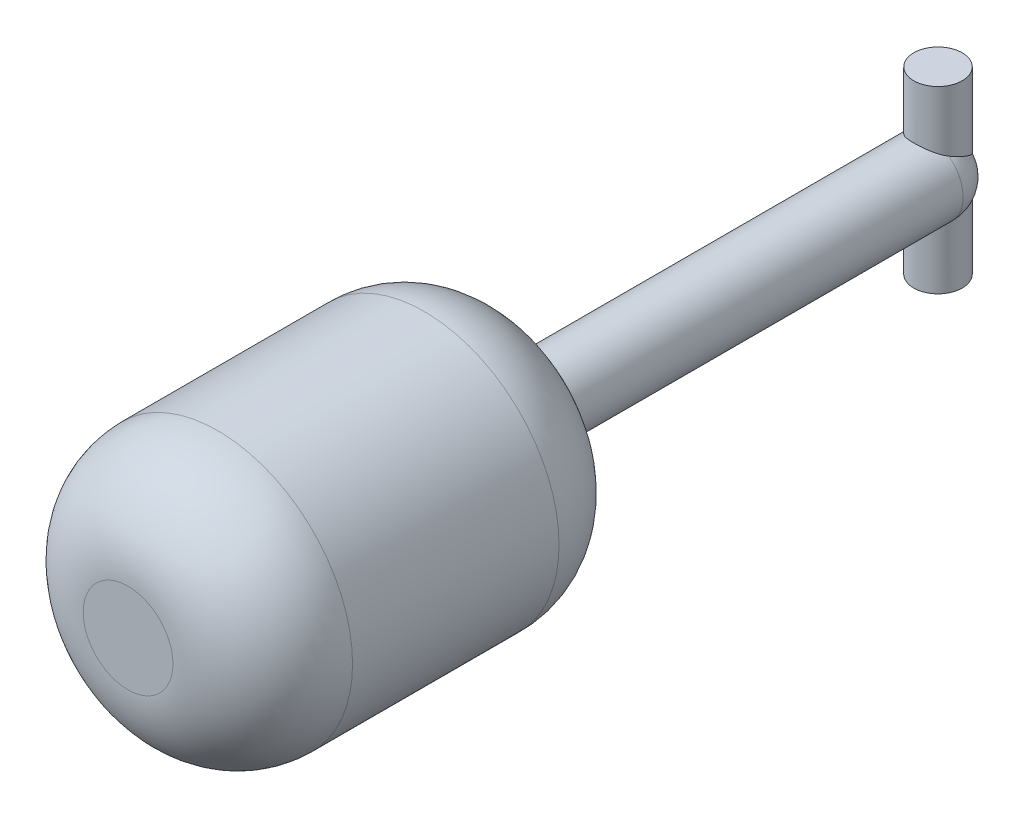
ISO-10303-21;
HEADER;
FILE_DESCRIPTION(('STEP AP214'),'2;1');
FILE_NAME('part.step','',(''),(''),'','','');
FILE_SCHEMA(('AUTOMOTIVE_DESIGN { 1 0 10303 214 1 1 1 1 }'));
ENDSEC;
DATA;
#1=APPLICATION_CONTEXT('core data for automotive mechanical design processes');
#2=APPLICATION_PROTOCOL_DEFINITION('international standard','automotive_design',2000,#1);
#3=PRODUCT_CONTEXT('',#1,'mechanical');
#4=PRODUCT('Part','Part','',(#3));
#5=PRODUCT_RELATED_PRODUCT_CATEGORY('part','',(#4));
#6=PRODUCT_DEFINITION_FORMATION('','',#4);
#7=PRODUCT_DEFINITION_CONTEXT('part definition',#1,'design');
#8=PRODUCT_DEFINITION('design','',#6,#7);
#9=PRODUCT_DEFINITION_SHAPE('','',#8);
#10=(LENGTH_UNIT() NAMED_UNIT(*) SI_UNIT(.MILLI.,.METRE.));
#11=(NAMED_UNIT(*) PLANE_ANGLE_UNIT() SI_UNIT($,.RADIAN.));
#12=(NAMED_UNIT(*) SI_UNIT($,.STERADIAN.) SOLID_ANGLE_UNIT());
#13=UNCERTAINTY_MEASURE_WITH_UNIT(LENGTH_MEASURE(1.E-05),#10,'distance_accuracy_value','');
#14=(GEOMETRIC_REPRESENTATION_CONTEXT(3) GLOBAL_UNCERTAINTY_ASSIGNED_CONTEXT((#13)) GLOBAL_UNIT_ASSIGNED_CONTEXT((#10,
#11,#12)) REPRESENTATION_CONTEXT('',''));
#15=CARTESIAN_POINT('',(0.,0.,0.));
#16=DIRECTION('',(0.,0.,1.));
#17=DIRECTION('',(1.,0.,0.));
#18=AXIS2_PLACEMENT_3D('',#15,#16,#17);
#19=CARTESIAN_POINT('',(0.,0.,90.));
#20=DIRECTION('',(0.,0.,-1.));
#21=DIRECTION('',(-1.,0.,0.));
#22=AXIS2_PLACEMENT_3D('',#19,#20,#21);
#23=CYLINDRICAL_SURFACE('',#22,15.);
#24=CARTESIAN_POINT('',(0.,0.,83.));
#25=DIRECTION('',(0.,0.,1.));
#26=DIRECTION('',(1.,0.,0.));
#27=AXIS2_PLACEMENT_3D('',#24,#25,#26);
#28=CIRCLE('',#27,15.);
#29=CARTESIAN_POINT('',(15.,0.,83.));
#30=VERTEX_POINT('',#29);
#31=EDGE_CURVE('E11',#30,#30,#28,.F.);
#32=ORIENTED_EDGE('',*,*,#31,.T.);
#33=EDGE_LOOP('',(#32));
#34=FACE_BOUND('',#33,.T.);
#35=CARTESIAN_POINT('',(0.,0.,60.));
#36=DIRECTION('',(0.,0.,1.));
#37=DIRECTION('',(1.,0.,0.));
#38=AXIS2_PLACEMENT_3D('',#35,#36,#37);
#39=CIRCLE('',#38,15.);
#40=CARTESIAN_POINT('',(15.,0.,60.));
#41=VERTEX_POINT('',#40);
#42=EDGE_CURVE('E60',#41,#41,#39,.T.);
#43=ORIENTED_EDGE('',*,*,#42,.T.);
#44=EDGE_LOOP('',(#43));
#45=FACE_BOUND('',#44,.T.);
#46=ADVANCED_FACE('F45',(#34,#45),#23,.T.);
#47=CARTESIAN_POINT('',(0.,0.,50.));
#48=DIRECTION('',(0.,0.,1.));
#49=DIRECTION('',(1.,0.,0.));
#50=AXIS2_PLACEMENT_3D('',#47,#48,#49);
#51=PLANE('',#50);
#52=CARTESIAN_POINT('',(0.,0.,50.));
#53=DIRECTION('',(0.,0.,1.));
#54=DIRECTION('',(1.,0.,0.));
#55=AXIS2_PLACEMENT_3D('',#52,#53,#54);
#56=CIRCLE('',#55,5.);
#57=CARTESIAN_POINT('',(5.,0.,50.));
#58=VERTEX_POINT('',#57);
#59=EDGE_CURVE('E56',#58,#58,#56,.F.);
#60=ORIENTED_EDGE('',*,*,#59,.T.);
#61=EDGE_LOOP('',(#60));
#62=FACE_BOUND('',#61,.T.);
#63=ADVANCED_FACE('F70',(#62),#51,.F.);
#64=CARTESIAN_POINT('',(0.,0.,60.));
#65=DIRECTION('',(0.,0.,1.));
#66=DIRECTION('',(1.,0.,0.));
#67=AXIS2_PLACEMENT_3D('',#64,#65,#66);
#68=DEGENERATE_TOROIDAL_SURFACE('',#67,5.,10.,.T.);
#69=ORIENTED_EDGE('',*,*,#59,.F.);
#70=EDGE_LOOP('',(#69));
#71=FACE_BOUND('',#70,.T.);
#72=ORIENTED_EDGE('',*,*,#42,.F.);
#73=EDGE_LOOP('',(#72));
#74=FACE_BOUND('',#73,.T.);
#75=ADVANCED_FACE('F67',(#71,#74),#68,.T.);
#76=CARTESIAN_POINT('',(0.,0.,93.));
#77=DIRECTION('',(0.,0.,1.));
#78=DIRECTION('',(1.,0.,0.));
#79=AXIS2_PLACEMENT_3D('',#76,#77,#78);
#80=PLANE('',#79);
#81=CARTESIAN_POINT('',(0.,0.,93.));
#82=DIRECTION('',(0.,0.,1.));
#83=DIRECTION('',(1.,0.,0.));
#84=AXIS2_PLACEMENT_3D('',#81,#82,#83);
#85=CIRCLE('',#84,5.);
#86=CARTESIAN_POINT('',(5.,0.,93.));
#87=VERTEX_POINT('',#86);
#88=EDGE_CURVE('E52',#87,#87,#85,.T.);
#89=ORIENTED_EDGE('',*,*,#88,.T.);
#90=EDGE_LOOP('',(#89));
#91=FACE_BOUND('',#90,.T.);
#92=ADVANCED_FACE('F69',(#91),#80,.T.);
#93=CARTESIAN_POINT('',(0.,0.,83.));
#94=DIRECTION('',(0.,0.,1.));
#95=DIRECTION('',(1.,0.,0.));
#96=AXIS2_PLACEMENT_3D('',#93,#94,#95);
#97=DEGENERATE_TOROIDAL_SURFACE('',#96,5.,10.,.T.);
#98=ORIENTED_EDGE('',*,*,#31,.F.);
#99=EDGE_LOOP('',(#98));
#100=FACE_BOUND('',#99,.T.);
#101=ORIENTED_EDGE('',*,*,#88,.F.);
#102=EDGE_LOOP('',(#101));
#103=FACE_BOUND('',#102,.T.);
#104=ADVANCED_FACE('F47',(#100,#103),#97,.T.);
#105=CLOSED_SHELL('',(#46,#63,#75,#92,#104));
#106=MANIFOLD_SOLID_BREP('B2',#105);
#107=CARTESIAN_POINT('',(0.,0.,50.));
#108=DIRECTION('',(0.,0.,-1.));
#109=DIRECTION('',(-1.,0.,0.));
#110=AXIS2_PLACEMENT_3D('',#107,#108,#109);
#111=CYLINDRICAL_SURFACE('',#110,4.);
#112=CARTESIAN_POINT('',(0.,-4.,5.5));
#113=CARTESIAN_POINT('',(0.13525164207156,-3.999993518137,5.49999290005186));
#114=CARTESIAN_POINT('',(0.270554028356534,-3.99307643232038,5.48977494154777));
#115=CARTESIAN_POINT('',(0.536851478418564,-3.9660753080996,5.44952242900665));
#116=CARTESIAN_POINT('',(0.667843000968334,-3.94598071504067,5.41947198982437));
#117=CARTESIAN_POINT('',(0.921237374068988,-3.89460751600821,5.34142171688508));
#118=CARTESIAN_POINT('',(1.04367877575305,-3.86338358991236,5.29350958802995));
#119=CARTESIAN_POINT('',(1.27825765475173,-3.79224252538454,5.18179668099204));
#120=CARTESIAN_POINT('',(1.39039412858649,-3.7523245416099,5.11799435768348));
#121=CARTESIAN_POINT('',(1.61205697896816,-3.66288843726566,4.970369372914));
#122=CARTESIAN_POINT('',(1.72053382128457,-3.61284047677658,4.88529862315981));
#123=CARTESIAN_POINT('',(1.92266533294142,-3.50945550197188,4.70056389289389));
#124=CARTESIAN_POINT('',(2.01629804570517,-3.45611377468099,4.60087870709038));
#125=CARTESIAN_POINT('',(2.2016374731949,-3.34162684993736,4.37099321756632));
#126=CARTESIAN_POINT('',(2.29056486800151,-3.28062033453726,4.23846616507814));
#127=CARTESIAN_POINT('',(2.44481502496016,-3.16733881888995,3.95694855652788));
#128=CARTESIAN_POINT('',(2.51017851323489,-3.11504883856034,3.80798699247689));
#129=CARTESIAN_POINT('',(2.5986388236772,-3.04127798290587,3.54196654773204));
#130=CARTESIAN_POINT('',(2.62851431747639,-3.01525894892984,3.42843373052885));
#131=CARTESIAN_POINT('',(2.67333867634867,-2.97559697930801,3.19643455089498));
#132=CARTESIAN_POINT('',(2.68831385195963,-2.96193223274288,3.07797727076724));
#133=CARTESIAN_POINT('',(2.70238874552766,-2.94910199602149,2.83876503424567));
#134=CARTESIAN_POINT('',(2.70141713183757,-2.95000165371578,2.71800216877523));
#135=CARTESIAN_POINT('',(2.68349689692319,-2.96630639076805,2.47863579362976));
#136=CARTESIAN_POINT('',(2.66653663287508,-2.98172204056105,2.36003392173356));
#137=CARTESIAN_POINT('',(2.6190035634682,-3.02353152860114,2.13402935766074));
#138=CARTESIAN_POINT('',(2.58914308881994,-3.04934666584866,2.02636280693319));
#139=CARTESIAN_POINT('',(2.5173142214509,-3.10890744847768,1.81747838350058));
#140=CARTESIAN_POINT('',(2.47533650857834,-3.14265919469987,1.71626554820684));
#141=CARTESIAN_POINT('',(2.35761593635998,-3.23255557456621,1.47431907083862));
#142=CARTESIAN_POINT('',(2.27532898573239,-3.29168544424409,1.3378595463383));
#143=CARTESIAN_POINT('',(2.08897003320918,-3.4130065102,1.08206274665898));
#144=CARTESIAN_POINT('',(1.98485850538836,-3.47520310205832,0.962757208751298));
#145=CARTESIAN_POINT('',(1.755422941596,-3.59659270451757,0.742336374084662));
#146=CARTESIAN_POINT('',(1.62993584933008,-3.65575770192453,0.641374254723838));
#147=CARTESIAN_POINT('',(1.36018379757103,-3.76442995528449,0.462050947950952));
#148=CARTESIAN_POINT('',(1.21595837203485,-3.81395701073601,0.383643264308921));
#149=CARTESIAN_POINT('',(0.945613760177467,-3.88856250325703,0.267726689034686));
#150=CARTESIAN_POINT('',(0.822549258937164,-3.91662580532116,0.225007032745261));
#151=CARTESIAN_POINT('',(0.569590487871059,-3.96131472415193,0.157527397342875));
#152=CARTESIAN_POINT('',(0.439700861576448,-3.97794801168562,0.132755372834098));
#153=CARTESIAN_POINT('',(0.176241405854664,-3.99830519761612,0.102487850774166));
#154=CARTESIAN_POINT('',(0.0426611239974739,-4.00198758891438,0.0970543316853545));
#155=CARTESIAN_POINT('',(-0.223536078802516,-3.99596741539106,0.105975754487917));
#156=CARTESIAN_POINT('',(-0.356152931631484,-3.98626391327706,0.120332082082308));
#157=CARTESIAN_POINT('',(-0.609770387964585,-3.95521155503772,0.166755901176293));
#158=CARTESIAN_POINT('',(-0.731019794201065,-3.9344727327074,0.19789662061766));
#159=CARTESIAN_POINT('',(-0.966225980547811,-3.88341424434936,0.275763868066081));
#160=CARTESIAN_POINT('',(-1.08018142454689,-3.85309282898366,0.32249324192658));
#161=CARTESIAN_POINT('',(-1.30794946620335,-3.7821492272186,0.434270876578236));
#162=CARTESIAN_POINT('',(-1.42096995748598,-3.74088228847242,0.500515025583156));
#163=CARTESIAN_POINT('',(-1.63481662527914,-3.65250451318952,0.647275590459889));
#164=CARTESIAN_POINT('',(-1.73563298865063,-3.60538903478359,0.727803364983003));
#165=CARTESIAN_POINT('',(-1.93982421981794,-3.50033540739044,0.916002443897186));
#166=CARTESIAN_POINT('',(-2.0408387055737,-3.44190010190649,1.02596063913661));
#167=CARTESIAN_POINT('',(-2.22383735602996,-3.32659589692022,1.26155719577649));
#168=CARTESIAN_POINT('',(-2.30581499668977,-3.26972754028787,1.38720091008296));
#169=CARTESIAN_POINT('',(-2.43828787268088,-3.17182959670112,1.63326598576168));
#170=CARTESIAN_POINT('',(-2.49164892498811,-3.12970180559621,1.75169899393767));
#171=CARTESIAN_POINT('',(-2.5814132242981,-3.0560916236245,1.99788464976802));
#172=CARTESIAN_POINT('',(-2.61784967930158,-3.02458841967376,2.12561847330661));
#173=CARTESIAN_POINT('',(-2.66752870963451,-2.98080925657186,2.36748916813316));
#174=CARTESIAN_POINT('',(-2.68349685770396,-2.96630524240168,2.4806518023036));
#175=CARTESIAN_POINT('',(-2.70088750358726,-2.9504848522829,2.70897630649806));
#176=CARTESIAN_POINT('',(-2.70232146140912,-2.94915808627297,2.82413652966416));
#177=CARTESIAN_POINT('',(-2.69056589995094,-2.95988294671172,3.05293007016665));
#178=CARTESIAN_POINT('',(-2.67739041434289,-2.97192173436909,3.1665647468844));
#179=CARTESIAN_POINT('',(-2.6372906054618,-3.00755697238461,3.38955541031351));
#180=CARTESIAN_POINT('',(-2.61034731289303,-3.03116936703232,3.49890526899653));
#181=CARTESIAN_POINT('',(-2.53309831794016,-3.09624097293121,3.74617838300419));
#182=CARTESIAN_POINT('',(-2.47803114343028,-3.14101248946805,3.88173007004604));
#183=CARTESIAN_POINT('',(-2.34852878478864,-3.23898118039819,4.13990562652224));
#184=CARTESIAN_POINT('',(-2.27406462296232,-3.29219091395031,4.26250976480838));
#185=CARTESIAN_POINT('',(-2.10591179352206,-3.40227029378641,4.49594141985187));
#186=CARTESIAN_POINT('',(-2.01188235686719,-3.45919050700335,4.60649852561071));
#187=CARTESIAN_POINT('',(-1.80654699356942,-3.57071683838806,4.81182535802022));
#188=CARTESIAN_POINT('',(-1.69523660906829,-3.62532235480782,4.90659099792986));
#189=CARTESIAN_POINT('',(-1.5096483541119,-3.70488819543881,5.04001039631132));
#190=CARTESIAN_POINT('',(-1.44082200773415,-3.73226129612847,5.08491845787222));
#191=CARTESIAN_POINT('',(-1.29855562801917,-3.78410818508872,5.16866190293594));
#192=CARTESIAN_POINT('',(-1.22511798891828,-3.80858345920418,5.20750040187114));
#193=CARTESIAN_POINT('',(-1.07415945769402,-3.85387849802484,5.27853308650619));
#194=CARTESIAN_POINT('',(-0.996645205253495,-3.87470398132586,5.31073768053859));
#195=CARTESIAN_POINT('',(-0.838076916347868,-3.91206651309577,5.36802149212262));
#196=CARTESIAN_POINT('',(-0.757024673840152,-3.92860570610492,5.39310427350142));
#197=CARTESIAN_POINT('',(-0.565494865818998,-3.96136585143772,5.44251238741761));
#198=CARTESIAN_POINT('',(-0.45394534906109,-3.97576987460958,5.46399374577891));
#199=CARTESIAN_POINT('',(-0.228275312759472,-3.99508798122612,5.49273799664422));
#200=CARTESIAN_POINT('',(-0.114155730903964,-4.00000547085267,5.50000599253183));
#201=CARTESIAN_POINT('',(0.,-4.,5.5));
#202=B_SPLINE_CURVE_WITH_KNOTS('',3,(#112,#113,#114,#115,#116,#117,#118,#119,#120,#121,#122,
#123,#124,#125,#126,#127,#128,#129,#130,#131,#132,#133,#134,#135,#136,#137,#138,#139,#140,#141,
#142,#143,#144,#145,#146,#147,#148,#149,#150,#151,#152,#153,#154,#155,#156,#157,#158,#159,#160,
#161,#162,#163,#164,#165,#166,#167,#168,#169,#170,#171,#172,#173,#174,#175,#176,#177,#178,#179,
#180,#181,#182,#183,#184,#185,#186,#187,#188,#189,#190,#191,#192,#193,#194,#195,#196,#197,#198,
#199,#200,#201),.UNSPECIFIED.,.T.,.F.,(4,2,2,2,2,2,2,2,2,2,2,2,2,2,2,2,2,2,2,2,2,2,2,2,2,2,2,2,
2,2,2,2,2,2,2,2,2,2,2,2,2,2,2,2,4),(0.,0.405302928326555,0.810930885199098,1.21459280341186,
1.61829398811156,2.05663420368272,2.49561685627629,3.00585079402765,3.51519860469972,
3.87452588033693,4.23321753456295,4.59351408943453,4.95407321257599,5.2968565192074,
5.63990418842015,6.14716538760557,6.65535333658142,7.16760729266616,7.67879753658696,
8.07687988795747,8.47469482173064,8.87378358021571,9.27290028467719,9.65195021770373,
10.0310693877148,10.4415600468648,10.8523786127248,11.3314859942209,11.8107573271643,
12.2189593065689,12.626356927887,12.9704053510091,13.3141824755843,13.6576296574618,
14.0015513222027,14.4581145208588,14.9153637431591,15.3813672616271,15.8474911924722,
16.107028588755,16.3664323269852,16.6254259179722,16.8842896766038,17.2264982663144,
17.5685839616301),.UNSPECIFIED.);
#203=CARTESIAN_POINT('',(-2.41867732448956,-3.1859064644148,4.));
#204=VERTEX_POINT('',#203);
#205=CARTESIAN_POINT('',(2.41867732448956,-3.1859064644148,4.));
#206=VERTEX_POINT('',#205);
#207=EDGE_CURVE('E153',#204,#206,#202,.T.);
#208=ORIENTED_EDGE('',*,*,#207,.T.);
#209=CARTESIAN_POINT('',(0.,0.,4.));
#210=DIRECTION('',(0.,0.,-1.));
#211=DIRECTION('',(-1.,0.,0.));
#212=AXIS2_PLACEMENT_3D('',#209,#210,#211);
#213=CIRCLE('',#212,4.);
#214=CARTESIAN_POINT('',(2.41867732448956,3.1859064644148,4.));
#215=VERTEX_POINT('',#214);
#216=EDGE_CURVE('E156',#206,#215,#213,.F.);
#217=ORIENTED_EDGE('',*,*,#216,.T.);
#218=CARTESIAN_POINT('',(0.,4.,5.5));
#219=CARTESIAN_POINT('',(-0.13525164207156,3.999993518137,5.49999290005186));
#220=CARTESIAN_POINT('',(-0.270554028356534,3.99307643232038,5.48977494154777));
#221=CARTESIAN_POINT('',(-0.536851478418564,3.9660753080996,5.44952242900665));
#222=CARTESIAN_POINT('',(-0.667843000968334,3.94598071504067,5.41947198982437));
#223=CARTESIAN_POINT('',(-0.921237374068988,3.89460751600821,5.34142171688508));
#224=CARTESIAN_POINT('',(-1.04367877575305,3.86338358991236,5.29350958802995));
#225=CARTESIAN_POINT('',(-1.27825765475173,3.79224252538454,5.18179668099204));
#226=CARTESIAN_POINT('',(-1.39039412858649,3.7523245416099,5.11799435768348));
#227=CARTESIAN_POINT('',(-1.61205697896816,3.66288843726566,4.970369372914));
#228=CARTESIAN_POINT('',(-1.72053382128457,3.61284047677658,4.88529862315981));
#229=CARTESIAN_POINT('',(-1.92266533294142,3.50945550197188,4.70056389289389));
#230=CARTESIAN_POINT('',(-2.01629804570517,3.45611377468099,4.60087870709038));
#231=CARTESIAN_POINT('',(-2.2016374731949,3.34162684993736,4.37099321756632));
#232=CARTESIAN_POINT('',(-2.29056486800151,3.28062033453726,4.23846616507814));
#233=CARTESIAN_POINT('',(-2.44481502496016,3.16733881888995,3.95694855652788));
#234=CARTESIAN_POINT('',(-2.51017851323489,3.11504883856034,3.80798699247689));
#235=CARTESIAN_POINT('',(-2.5986388236772,3.04127798290587,3.54196654773204));
#236=CARTESIAN_POINT('',(-2.62851431747639,3.01525894892984,3.42843373052885));
#237=CARTESIAN_POINT('',(-2.67333867634867,2.97559697930801,3.19643455089498));
#238=CARTESIAN_POINT('',(-2.68831385195963,2.96193223274288,3.07797727076724));
#239=CARTESIAN_POINT('',(-2.70238874552766,2.94910199602149,2.83876503424567));
#240=CARTESIAN_POINT('',(-2.70141713183757,2.95000165371578,2.71800216877523));
#241=CARTESIAN_POINT('',(-2.68349689692319,2.96630639076805,2.47863579362976));
#242=CARTESIAN_POINT('',(-2.66653663287508,2.98172204056105,2.36003392173356));
#243=CARTESIAN_POINT('',(-2.6190035634682,3.02353152860114,2.13402935766074));
#244=CARTESIAN_POINT('',(-2.58914308881994,3.04934666584866,2.02636280693319));
#245=CARTESIAN_POINT('',(-2.5173142214509,3.10890744847768,1.81747838350058));
#246=CARTESIAN_POINT('',(-2.47533650857834,3.14265919469987,1.71626554820684));
#247=CARTESIAN_POINT('',(-2.35761593635998,3.23255557456621,1.47431907083862));
#248=CARTESIAN_POINT('',(-2.27532898573239,3.29168544424409,1.3378595463383));
#249=CARTESIAN_POINT('',(-2.08897003320918,3.4130065102,1.08206274665898));
#250=CARTESIAN_POINT('',(-1.98485850538836,3.47520310205832,0.962757208751298));
#251=CARTESIAN_POINT('',(-1.755422941596,3.59659270451757,0.742336374084662));
#252=CARTESIAN_POINT('',(-1.62993584933008,3.65575770192453,0.641374254723838));
#253=CARTESIAN_POINT('',(-1.36018379757103,3.76442995528449,0.462050947950952));
#254=CARTESIAN_POINT('',(-1.21595837203485,3.81395701073601,0.383643264308921));
#255=CARTESIAN_POINT('',(-0.945613760177467,3.88856250325703,0.267726689034686));
#256=CARTESIAN_POINT('',(-0.822549258937164,3.91662580532116,0.225007032745261));
#257=CARTESIAN_POINT('',(-0.569590487871059,3.96131472415193,0.157527397342875));
#258=CARTESIAN_POINT('',(-0.439700861576448,3.97794801168562,0.132755372834098));
#259=CARTESIAN_POINT('',(-0.176241405854664,3.99830519761612,0.102487850774166));
#260=CARTESIAN_POINT('',(-0.0426611239974739,4.00198758891438,0.0970543316853545));
#261=CARTESIAN_POINT('',(0.223536078802516,3.99596741539106,0.105975754487917));
#262=CARTESIAN_POINT('',(0.356152931631484,3.98626391327706,0.120332082082308));
#263=CARTESIAN_POINT('',(0.609770387964585,3.95521155503772,0.166755901176293));
#264=CARTESIAN_POINT('',(0.731019794201065,3.9344727327074,0.19789662061766));
#265=CARTESIAN_POINT('',(0.966225980547811,3.88341424434936,0.275763868066081));
#266=CARTESIAN_POINT('',(1.08018142454689,3.85309282898366,0.32249324192658));
#267=CARTESIAN_POINT('',(1.30794946620335,3.7821492272186,0.434270876578236));
#268=CARTESIAN_POINT('',(1.42096995748598,3.74088228847242,0.500515025583156));
#269=CARTESIAN_POINT('',(1.63481662527914,3.65250451318952,0.647275590459889));
#270=CARTESIAN_POINT('',(1.73563298865063,3.60538903478359,0.727803364983003));
#271=CARTESIAN_POINT('',(1.93982421981794,3.50033540739044,0.916002443897186));
#272=CARTESIAN_POINT('',(2.0408387055737,3.44190010190649,1.02596063913661));
#273=CARTESIAN_POINT('',(2.22383735602996,3.32659589692022,1.26155719577649));
#274=CARTESIAN_POINT('',(2.30581499668977,3.26972754028787,1.38720091008296));
#275=CARTESIAN_POINT('',(2.43828787268088,3.17182959670112,1.63326598576168));
#276=CARTESIAN_POINT('',(2.49164892498811,3.12970180559621,1.75169899393767));
#277=CARTESIAN_POINT('',(2.5814132242981,3.0560916236245,1.99788464976802));
#278=CARTESIAN_POINT('',(2.61784967930158,3.02458841967376,2.12561847330661));
#279=CARTESIAN_POINT('',(2.66752870963451,2.98080925657186,2.36748916813316));
#280=CARTESIAN_POINT('',(2.68349685770396,2.96630524240168,2.4806518023036));
#281=CARTESIAN_POINT('',(2.70088750358726,2.9504848522829,2.70897630649806));
#282=CARTESIAN_POINT('',(2.70232146140912,2.94915808627297,2.82413652966416));
#283=CARTESIAN_POINT('',(2.69056589995094,2.95988294671172,3.05293007016665));
#284=CARTESIAN_POINT('',(2.67739041434289,2.97192173436909,3.1665647468844));
#285=CARTESIAN_POINT('',(2.6372906054618,3.00755697238461,3.38955541031351));
#286=CARTESIAN_POINT('',(2.61034731289303,3.03116936703232,3.49890526899653));
#287=CARTESIAN_POINT('',(2.53309831794016,3.09624097293121,3.74617838300419));
#288=CARTESIAN_POINT('',(2.47803114343028,3.14101248946805,3.88173007004604));
#289=CARTESIAN_POINT('',(2.34852878478864,3.23898118039819,4.13990562652224));
#290=CARTESIAN_POINT('',(2.27406462296232,3.29219091395031,4.26250976480838));
#291=CARTESIAN_POINT('',(2.10591179352206,3.40227029378641,4.49594141985187));
#292=CARTESIAN_POINT('',(2.01188235686719,3.45919050700335,4.60649852561071));
#293=CARTESIAN_POINT('',(1.80654699356942,3.57071683838806,4.81182535802022));
#294=CARTESIAN_POINT('',(1.69523660906829,3.62532235480782,4.90659099792986));
#295=CARTESIAN_POINT('',(1.5096483541119,3.70488819543881,5.04001039631132));
#296=CARTESIAN_POINT('',(1.44082200773415,3.73226129612847,5.08491845787222));
#297=CARTESIAN_POINT('',(1.29855562801917,3.78410818508872,5.16866190293594));
#298=CARTESIAN_POINT('',(1.22511798891828,3.80858345920418,5.20750040187114));
#299=CARTESIAN_POINT('',(1.07415945769402,3.85387849802484,5.27853308650619));
#300=CARTESIAN_POINT('',(0.996645205253495,3.87470398132586,5.31073768053859));
#301=CARTESIAN_POINT('',(0.838076916347868,3.91206651309577,5.36802149212262));
#302=CARTESIAN_POINT('',(0.757024673840152,3.92860570610492,5.39310427350142));
#303=CARTESIAN_POINT('',(0.565494865818998,3.96136585143772,5.44251238741761));
#304=CARTESIAN_POINT('',(0.45394534906109,3.97576987460958,5.46399374577891));
#305=CARTESIAN_POINT('',(0.228275312759472,3.99508798122612,5.49273799664422));
#306=CARTESIAN_POINT('',(0.114155730903964,4.00000547085267,5.50000599253183));
#307=CARTESIAN_POINT('',(0.,4.,5.5));
#308=B_SPLINE_CURVE_WITH_KNOTS('',3,(#218,#219,#220,#221,#222,#223,#224,#225,#226,#227,#228,
#229,#230,#231,#232,#233,#234,#235,#236,#237,#238,#239,#240,#241,#242,#243,#244,#245,#246,#247,
#248,#249,#250,#251,#252,#253,#254,#255,#256,#257,#258,#259,#260,#261,#262,#263,#264,#265,#266,
#267,#268,#269,#270,#271,#272,#273,#274,#275,#276,#277,#278,#279,#280,#281,#282,#283,#284,#285,
#286,#287,#288,#289,#290,#291,#292,#293,#294,#295,#296,#297,#298,#299,#300,#301,#302,#303,#304,
#305,#306,#307),.UNSPECIFIED.,.T.,.F.,(4,2,2,2,2,2,2,2,2,2,2,2,2,2,2,2,2,2,2,2,2,2,2,2,2,2,2,2,
2,2,2,2,2,2,2,2,2,2,2,2,2,2,2,2,4),(0.,0.405302928326555,0.810930885199098,1.21459280341186,
1.61829398811156,2.05663420368272,2.49561685627629,3.00585079402765,3.51519860469972,
3.87452588033693,4.23321753456295,4.59351408943453,4.95407321257599,5.2968565192074,
5.63990418842015,6.14716538760557,6.65535333658142,7.16760729266616,7.67879753658696,
8.07687988795747,8.47469482173064,8.87378358021571,9.27290028467719,9.65195021770373,
10.0310693877148,10.4415600468648,10.8523786127248,11.3314859942209,11.8107573271643,
12.2189593065689,12.626356927887,12.9704053510091,13.3141824755843,13.6576296574618,
14.0015513222027,14.4581145208588,14.9153637431591,15.3813672616271,15.8474911924722,
16.107028588755,16.3664323269852,16.6254259179722,16.8842896766038,17.2264982663144,
17.5685839616301),.UNSPECIFIED.);
#309=CARTESIAN_POINT('',(-2.41867732448956,3.1859064644148,4.));
#310=VERTEX_POINT('',#309);
#311=EDGE_CURVE('E159',#215,#310,#308,.T.);
#312=ORIENTED_EDGE('',*,*,#311,.T.);
#313=CARTESIAN_POINT('',(0.,0.,4.));
#314=DIRECTION('',(0.,0.,-1.));
#315=DIRECTION('',(-1.,0.,0.));
#316=AXIS2_PLACEMENT_3D('',#313,#314,#315);
#317=CIRCLE('',#316,4.);
#318=EDGE_CURVE('E157',#310,#204,#317,.F.);
#319=ORIENTED_EDGE('',*,*,#318,.T.);
#320=EDGE_LOOP('',(#208,#217,#312,#319));
#321=FACE_BOUND('',#320,.T.);
#322=CARTESIAN_POINT('',(0.,0.,50.));
#323=DIRECTION('',(0.,0.,1.));
#324=DIRECTION('',(1.,0.,0.));
#325=AXIS2_PLACEMENT_3D('',#322,#323,#324);
#326=CIRCLE('',#325,4.);
#327=CARTESIAN_POINT('',(4.,0.,50.));
#328=VERTEX_POINT('',#327);
#329=EDGE_CURVE('E158',#328,#328,#326,.T.);
#330=ORIENTED_EDGE('',*,*,#329,.F.);
#331=EDGE_LOOP('',(#330));
#332=FACE_BOUND('',#331,.T.);
#333=ADVANCED_FACE('F119',(#321,#332),#111,.T.);
#334=CARTESIAN_POINT('',(0.,0.,50.));
#335=DIRECTION('',(0.,0.,1.));
#336=DIRECTION('',(1.,0.,0.));
#337=AXIS2_PLACEMENT_3D('',#334,#335,#336);
#338=PLANE('',#337);
#339=ORIENTED_EDGE('',*,*,#329,.T.);
#340=EDGE_LOOP('',(#339));
#341=FACE_BOUND('',#340,.T.);
#342=ADVANCED_FACE('F174',(#341),#338,.T.);
#343=CARTESIAN_POINT('',(0.,10.,2.8));
#344=DIRECTION('',(0.,1.,0.));
#345=DIRECTION('',(0.,0.,1.));
#346=AXIS2_PLACEMENT_3D('',#343,#344,#345);
#347=PLANE('',#346);
#348=CARTESIAN_POINT('',(0.,10.,2.8));
#349=DIRECTION('',(0.,1.,0.));
#350=DIRECTION('',(0.,0.,1.));
#351=AXIS2_PLACEMENT_3D('',#348,#349,#350);
#352=CIRCLE('',#351,2.7);
#353=CARTESIAN_POINT('',(0.,10.,5.5));
#354=VERTEX_POINT('',#353);
#355=EDGE_CURVE('E202',#354,#354,#352,.T.);
#356=ORIENTED_EDGE('',*,*,#355,.T.);
#357=EDGE_LOOP('',(#356));
#358=FACE_BOUND('',#357,.T.);
#359=ADVANCED_FACE('F190',(#358),#347,.T.);
#360=CARTESIAN_POINT('',(0.,-10.,2.8));
#361=DIRECTION('',(0.,1.,0.));
#362=DIRECTION('',(0.,0.,1.));
#363=AXIS2_PLACEMENT_3D('',#360,#361,#362);
#364=CYLINDRICAL_SURFACE('',#363,2.7);
#365=ORIENTED_EDGE('',*,*,#355,.F.);
#366=EDGE_LOOP('',(#365));
#367=FACE_BOUND('',#366,.T.);
#368=ORIENTED_EDGE('',*,*,#311,.F.);
#369=CARTESIAN_POINT('',(2.41867732448956,3.1859064644148,4.));
#370=CARTESIAN_POINT('',(2.45492909212995,3.15839294052425,3.92695156175379));
#371=CARTESIAN_POINT('',(2.48771758414108,3.13000536775839,3.85253309888428));
#372=CARTESIAN_POINT('',(2.5462875463546,3.07160980134171,3.70163996331981));
#373=CARTESIAN_POINT('',(2.57207178506884,3.04160245356395,3.62516611621247));
#374=CARTESIAN_POINT('',(2.61651394704203,2.98016653939499,3.47102175748681));
#375=CARTESIAN_POINT('',(2.63519328844404,2.94874256908289,3.39335558866504));
#376=CARTESIAN_POINT('',(2.66554795634037,2.88451498860138,3.23724727235669));
#377=CARTESIAN_POINT('',(2.67722272116352,2.85171126802051,3.1588050631548));
#378=CARTESIAN_POINT('',(2.70177380998873,2.75148238785563,2.92342003797799));
#379=CARTESIAN_POINT('',(2.70426727363915,2.6821133879833,2.76609970409627));
#380=CARTESIAN_POINT('',(2.68244284826093,2.53924826569995,2.45527894351562));
#381=CARTESIAN_POINT('',(2.65810837399867,2.46574961698045,2.30178093982925));
#382=CARTESIAN_POINT('',(2.58216098097444,2.31151274042805,1.99451491081083));
#383=CARTESIAN_POINT('',(2.52914377106274,2.2305979607114,1.84118137087347));
#384=CARTESIAN_POINT('',(2.39726440990543,2.0664998267294,1.54737058527257));
#385=CARTESIAN_POINT('',(2.31839376328676,1.98331573502217,1.40689758498602));
#386=CARTESIAN_POINT('',(2.13261632615453,1.81191866756234,1.13555791019331));
#387=CARTESIAN_POINT('',(2.02447252286078,1.72366774581649,1.00556135860579));
#388=CARTESIAN_POINT('',(1.78511587142593,1.54890090973741,0.767293976985714));
#389=CARTESIAN_POINT('',(1.6539000086965,1.46238522377728,0.659025989964246));
#390=CARTESIAN_POINT('',(1.39976170276442,1.31286762226291,0.487171743732233));
#391=CARTESIAN_POINT('',(1.28063272628901,1.24867576923872,0.418975848123361));
#392=CARTESIAN_POINT('',(1.02981939899475,1.12879255800611,0.300264880085191));
#393=CARTESIAN_POINT('',(0.898153047463098,1.07308930340872,0.249724932739597));
#394=CARTESIAN_POINT('',(0.667524305264882,0.993936363768694,0.182023631836956));
#395=CARTESIAN_POINT('',(0.571787128146326,0.965883989804139,0.159353101504469));
#396=CARTESIAN_POINT('',(0.375925348745507,0.921522601580009,0.124460168068232));
#397=CARTESIAN_POINT('',(0.275815606333575,0.905176666666471,0.112204893509688));
#398=CARTESIAN_POINT('',(0.0725518660397015,0.887584973184206,0.0990438323241006));
#399=CARTESIAN_POINT('',(-0.0306209302243758,0.886470540154456,0.0982367494038772));
#400=CARTESIAN_POINT('',(-0.235427075246509,0.900000129668845,0.108321065602293));
#401=CARTESIAN_POINT('',(-0.33705732241985,0.914672490514452,0.119233501939872));
#402=CARTESIAN_POINT('',(-0.557557621597311,0.960951039300038,0.155340678482988));
#403=CARTESIAN_POINT('',(-0.675336051467573,0.995559276477172,0.18313737793216));
#404=CARTESIAN_POINT('',(-0.90273696885123,1.07603514545891,0.252592497250774));
#405=CARTESIAN_POINT('',(-1.0123343037691,1.12193577572369,0.294291671899593));
#406=CARTESIAN_POINT('',(-1.26693117410655,1.24054788446713,0.410070133545281));
#407=CARTESIAN_POINT('',(-1.40760560239678,1.31645170962748,0.490399602611999));
#408=CARTESIAN_POINT('',(-1.67050470163606,1.47341152921662,0.672795583504314));
#409=CARTESIAN_POINT('',(-1.79272961296779,1.55446745649802,0.774861812075268));
#410=CARTESIAN_POINT('',(-2.01874952012815,1.71948159612509,0.99987583664803));
#411=CARTESIAN_POINT('',(-2.12222446149325,1.80346540407797,1.12312677331));
#412=CARTESIAN_POINT('',(-2.30587765238736,1.97079475944154,1.38625651334894));
#413=CARTESIAN_POINT('',(-2.38605766094522,2.05414035458149,1.52613406010572));
#414=CARTESIAN_POINT('',(-2.52499774093039,2.22397859091484,1.82850634896866));
#415=CARTESIAN_POINT('',(-2.58203991275473,2.31032682045033,1.99187836865068));
#416=CARTESIAN_POINT('',(-2.66416596942132,2.47903828385741,2.32854206432491));
#417=CARTESIAN_POINT('',(-2.68923468396405,2.56139960826485,2.50183840835165));
#418=CARTESIAN_POINT('',(-2.70492604193906,2.71824004175907,2.84703410196455));
#419=CARTESIAN_POINT('',(-2.69661758306547,2.79288642663049,3.01880296463759));
#420=CARTESIAN_POINT('',(-2.65938379374456,2.89999943414183,3.27446502683593));
#421=CARTESIAN_POINT('',(-2.64285848201909,2.93487808579927,3.35931184263062));
#422=CARTESIAN_POINT('',(-2.60154059608988,3.00291872124253,3.52765293169975));
#423=CARTESIAN_POINT('',(-2.57675311940873,3.0360817489818,3.61114800573667));
#424=CARTESIAN_POINT('',(-2.52958039101996,3.08869003319145,3.74566243106615));
#425=CARTESIAN_POINT('',(-2.50965959138155,3.10869798878368,3.79734087147987));
#426=CARTESIAN_POINT('',(-2.46658618862746,3.14790705473736,3.8995563465974));
#427=CARTESIAN_POINT('',(-2.44343784324495,3.16710918540636,3.95009478475804));
#428=CARTESIAN_POINT('',(-2.41867732448956,3.1859064644148,4.));
#429=B_SPLINE_CURVE_WITH_KNOTS('',3,(#369,#370,#371,#372,#373,#374,#375,#376,#377,#378,#379,
#380,#381,#382,#383,#384,#385,#386,#387,#388,#389,#390,#391,#392,#393,#394,#395,#396,#397,#398,
#399,#400,#401,#402,#403,#404,#405,#406,#407,#408,#409,#410,#411,#412,#413,#414,#415,#416,#417,
#418,#419,#420,#421,#422,#423,#424,#425,#426,#427,#428),.UNSPECIFIED.,.F.,.F.,(4,2,2,2,2,2,2,2,
2,2,2,2,2,2,2,2,2,2,2,2,2,2,2,2,2,2,2,2,2,4),(0.,0.258086941827533,0.516071722891899,
0.773272510369538,1.03049391907481,1.54388522125664,2.05759408387639,2.59908937845856,
3.14076278567603,3.71039594963617,4.28010359707556,4.73328103712461,5.18581741003041,
5.49173638504154,5.79668622909824,6.10426369887705,6.41239421237403,6.78792446473916,
7.16456539919241,7.69846751789102,8.23236267966481,8.77465384144306,9.3169040435035,
9.8941762313189,10.4717222130534,11.0309222188489,11.3102425545969,11.5893908755865,
11.7659598468978,11.9422980567399),.UNSPECIFIED.);
#430=EDGE_CURVE('E132',#215,#310,#429,.T.);
#431=ORIENTED_EDGE('',*,*,#430,.T.);
#432=EDGE_LOOP('',(#368,#431));
#433=FACE_BOUND('',#432,.T.);
#434=ADVANCED_FACE('F171',(#367,#433),#364,.T.);
#435=CARTESIAN_POINT('',(0.,-10.,2.8));
#436=DIRECTION('',(0.,1.,0.));
#437=DIRECTION('',(0.,0.,1.));
#438=AXIS2_PLACEMENT_3D('',#435,#436,#437);
#439=CIRCLE('',#438,2.7);
#440=CARTESIAN_POINT('',(0.,-10.,5.5));
#441=VERTEX_POINT('',#440);
#442=EDGE_CURVE('E199',#441,#441,#439,.T.);
#443=ORIENTED_EDGE('',*,*,#442,.T.);
#444=EDGE_LOOP('',(#443));
#445=FACE_BOUND('',#444,.T.);
#446=ORIENTED_EDGE('',*,*,#207,.F.);
#447=CARTESIAN_POINT('',(-2.41867732448956,-3.1859064644148,4.));
#448=CARTESIAN_POINT('',(-2.45492909212995,-3.15839294052425,3.92695156175379));
#449=CARTESIAN_POINT('',(-2.48771758414108,-3.13000536775839,3.85253309888428));
#450=CARTESIAN_POINT('',(-2.5462875463546,-3.07160980134171,3.70163996331981));
#451=CARTESIAN_POINT('',(-2.57207178506884,-3.04160245356395,3.62516611621247));
#452=CARTESIAN_POINT('',(-2.61651394704203,-2.98016653939499,3.47102175748681));
#453=CARTESIAN_POINT('',(-2.63519328844404,-2.94874256908289,3.39335558866504));
#454=CARTESIAN_POINT('',(-2.66554795634037,-2.88451498860138,3.23724727235669));
#455=CARTESIAN_POINT('',(-2.67722272116352,-2.85171126802051,3.1588050631548));
#456=CARTESIAN_POINT('',(-2.70177380998873,-2.75148238785563,2.92342003797799));
#457=CARTESIAN_POINT('',(-2.70426727363915,-2.6821133879833,2.76609970409627));
#458=CARTESIAN_POINT('',(-2.68244284826093,-2.53924826569995,2.45527894351562));
#459=CARTESIAN_POINT('',(-2.65810837399867,-2.46574961698045,2.30178093982925));
#460=CARTESIAN_POINT('',(-2.58216098097444,-2.31151274042805,1.99451491081083));
#461=CARTESIAN_POINT('',(-2.52914377106274,-2.2305979607114,1.84118137087347));
#462=CARTESIAN_POINT('',(-2.39726440990543,-2.0664998267294,1.54737058527257));
#463=CARTESIAN_POINT('',(-2.31839376328676,-1.98331573502217,1.40689758498602));
#464=CARTESIAN_POINT('',(-2.13261632615453,-1.81191866756234,1.13555791019331));
#465=CARTESIAN_POINT('',(-2.02447252286078,-1.72366774581649,1.00556135860579));
#466=CARTESIAN_POINT('',(-1.78511587142593,-1.54890090973741,0.767293976985714));
#467=CARTESIAN_POINT('',(-1.6539000086965,-1.46238522377728,0.659025989964246));
#468=CARTESIAN_POINT('',(-1.39976170276442,-1.31286762226291,0.487171743732233));
#469=CARTESIAN_POINT('',(-1.28063272628901,-1.24867576923872,0.418975848123361));
#470=CARTESIAN_POINT('',(-1.02981939899475,-1.12879255800611,0.300264880085191));
#471=CARTESIAN_POINT('',(-0.898153047463098,-1.07308930340872,0.249724932739597));
#472=CARTESIAN_POINT('',(-0.667524305264882,-0.993936363768694,0.182023631836956));
#473=CARTESIAN_POINT('',(-0.571787128146326,-0.965883989804139,0.159353101504469));
#474=CARTESIAN_POINT('',(-0.375925348745507,-0.921522601580009,0.124460168068232));
#475=CARTESIAN_POINT('',(-0.275815606333575,-0.905176666666471,0.112204893509688));
#476=CARTESIAN_POINT('',(-0.0725518660397015,-0.887584973184206,0.0990438323241006));
#477=CARTESIAN_POINT('',(0.0306209302243758,-0.886470540154456,0.0982367494038772));
#478=CARTESIAN_POINT('',(0.235427075246509,-0.900000129668845,0.108321065602293));
#479=CARTESIAN_POINT('',(0.33705732241985,-0.914672490514452,0.119233501939872));
#480=CARTESIAN_POINT('',(0.557557621597311,-0.960951039300038,0.155340678482988));
#481=CARTESIAN_POINT('',(0.675336051467573,-0.995559276477172,0.18313737793216));
#482=CARTESIAN_POINT('',(0.90273696885123,-1.07603514545891,0.252592497250774));
#483=CARTESIAN_POINT('',(1.0123343037691,-1.12193577572369,0.294291671899593));
#484=CARTESIAN_POINT('',(1.26693117410655,-1.24054788446713,0.410070133545281));
#485=CARTESIAN_POINT('',(1.40760560239678,-1.31645170962748,0.490399602611999));
#486=CARTESIAN_POINT('',(1.67050470163606,-1.47341152921662,0.672795583504314));
#487=CARTESIAN_POINT('',(1.79272961296779,-1.55446745649802,0.774861812075268));
#488=CARTESIAN_POINT('',(2.01874952012815,-1.71948159612509,0.99987583664803));
#489=CARTESIAN_POINT('',(2.12222446149325,-1.80346540407797,1.12312677331));
#490=CARTESIAN_POINT('',(2.30587765238736,-1.97079475944154,1.38625651334894));
#491=CARTESIAN_POINT('',(2.38605766094522,-2.05414035458149,1.52613406010572));
#492=CARTESIAN_POINT('',(2.52499774093039,-2.22397859091484,1.82850634896866));
#493=CARTESIAN_POINT('',(2.58203991275473,-2.31032682045033,1.99187836865068));
#494=CARTESIAN_POINT('',(2.66416596942132,-2.47903828385741,2.32854206432491));
#495=CARTESIAN_POINT('',(2.68923468396405,-2.56139960826485,2.50183840835165));
#496=CARTESIAN_POINT('',(2.70492604193906,-2.71824004175907,2.84703410196455));
#497=CARTESIAN_POINT('',(2.69661758306547,-2.79288642663049,3.01880296463759));
#498=CARTESIAN_POINT('',(2.65938379374456,-2.89999943414183,3.27446502683593));
#499=CARTESIAN_POINT('',(2.64285848201909,-2.93487808579927,3.35931184263062));
#500=CARTESIAN_POINT('',(2.60154059608988,-3.00291872124253,3.52765293169975));
#501=CARTESIAN_POINT('',(2.57675311940873,-3.0360817489818,3.61114800573667));
#502=CARTESIAN_POINT('',(2.52958039101996,-3.08869003319145,3.74566243106615));
#503=CARTESIAN_POINT('',(2.50965959138155,-3.10869798878368,3.79734087147987));
#504=CARTESIAN_POINT('',(2.46658618862746,-3.14790705473736,3.8995563465974));
#505=CARTESIAN_POINT('',(2.44343784324495,-3.16710918540636,3.95009478475804));
#506=CARTESIAN_POINT('',(2.41867732448956,-3.1859064644148,4.));
#507=B_SPLINE_CURVE_WITH_KNOTS('',3,(#447,#448,#449,#450,#451,#452,#453,#454,#455,#456,#457,
#458,#459,#460,#461,#462,#463,#464,#465,#466,#467,#468,#469,#470,#471,#472,#473,#474,#475,#476,
#477,#478,#479,#480,#481,#482,#483,#484,#485,#486,#487,#488,#489,#490,#491,#492,#493,#494,#495,
#496,#497,#498,#499,#500,#501,#502,#503,#504,#505,#506),.UNSPECIFIED.,.F.,.F.,(4,2,2,2,2,2,2,2,
2,2,2,2,2,2,2,2,2,2,2,2,2,2,2,2,2,2,2,2,2,4),(0.,0.258086941827533,0.516071722891899,
0.773272510369538,1.03049391907481,1.54388522125664,2.05759408387639,2.59908937845856,
3.14076278567603,3.71039594963617,4.28010359707556,4.73328103712461,5.18581741003041,
5.49173638504154,5.79668622909824,6.10426369887705,6.41239421237403,6.78792446473916,
7.16456539919241,7.69846751789102,8.23236267966481,8.77465384144306,9.3169040435035,
9.8941762313189,10.4717222130534,11.0309222188489,11.3102425545969,11.5893908755865,
11.7659598468978,11.9422980567399),.UNSPECIFIED.);
#508=EDGE_CURVE('E43',#204,#206,#507,.T.);
#509=ORIENTED_EDGE('',*,*,#508,.T.);
#510=EDGE_LOOP('',(#446,#509));
#511=FACE_BOUND('',#510,.T.);
#512=ADVANCED_FACE('F152',(#445,#511),#364,.T.);
#513=CARTESIAN_POINT('',(0.,-10.,2.8));
#514=DIRECTION('',(0.,1.,0.));
#515=DIRECTION('',(0.,0.,1.));
#516=AXIS2_PLACEMENT_3D('',#513,#514,#515);
#517=PLANE('',#516);
#518=ORIENTED_EDGE('',*,*,#442,.F.);
#519=EDGE_LOOP('',(#518));
#520=FACE_BOUND('',#519,.T.);
#521=ADVANCED_FACE('F170',(#520),#517,.F.);
#522=CARTESIAN_POINT('',(0.,0.,4.));
#523=DIRECTION('',(0.,0.,1.));
#524=DIRECTION('',(1.,0.,0.));
#525=AXIS2_PLACEMENT_3D('',#522,#523,#524);
#526=SPHERICAL_SURFACE('',#525,4.);
#527=ORIENTED_EDGE('',*,*,#430,.F.);
#528=ORIENTED_EDGE('',*,*,#216,.F.);
#529=ORIENTED_EDGE('',*,*,#508,.F.);
#530=ORIENTED_EDGE('',*,*,#318,.F.);
#531=EDGE_LOOP('',(#527,#528,#529,#530));
#532=FACE_BOUND('',#531,.T.);
#533=ADVANCED_FACE('F121',(#532),#526,.T.);
#534=CLOSED_SHELL('',(#333,#342,#359,#434,#512,#521,#533));
#535=MANIFOLD_SOLID_BREP('B6',#534);
#536=ADVANCED_BREP_SHAPE_REPRESENTATION('',(#18,#106,#535),#14);
#537=SHAPE_DEFINITION_REPRESENTATION(#9,#536);
ENDSEC;
END-ISO-10303-21;
